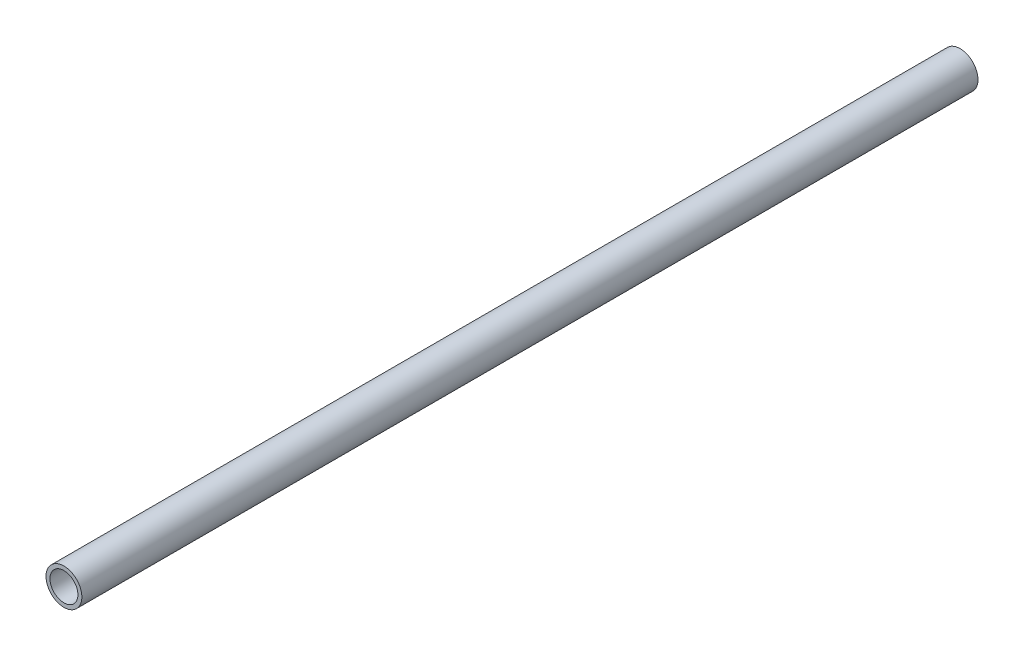
ISO-10303-21;
HEADER;
FILE_DESCRIPTION(('STEP AP214'),'2;1');
FILE_NAME('part.step','',(''),(''),'','','');
FILE_SCHEMA(('AUTOMOTIVE_DESIGN { 1 0 10303 214 1 1 1 1 }'));
ENDSEC;
DATA;
#1=APPLICATION_CONTEXT('core data for automotive mechanical design processes');
#2=APPLICATION_PROTOCOL_DEFINITION('international standard','automotive_design',2000,#1);
#3=PRODUCT_CONTEXT('',#1,'mechanical');
#4=PRODUCT('Part','Part','',(#3));
#5=PRODUCT_RELATED_PRODUCT_CATEGORY('part','',(#4));
#6=PRODUCT_DEFINITION_FORMATION('','',#4);
#7=PRODUCT_DEFINITION_CONTEXT('part definition',#1,'design');
#8=PRODUCT_DEFINITION('design','',#6,#7);
#9=PRODUCT_DEFINITION_SHAPE('','',#8);
#10=(LENGTH_UNIT() NAMED_UNIT(*) SI_UNIT(.MILLI.,.METRE.));
#11=(NAMED_UNIT(*) PLANE_ANGLE_UNIT() SI_UNIT($,.RADIAN.));
#12=(NAMED_UNIT(*) SI_UNIT($,.STERADIAN.) SOLID_ANGLE_UNIT());
#13=UNCERTAINTY_MEASURE_WITH_UNIT(LENGTH_MEASURE(1.E-05),#10,'distance_accuracy_value','');
#14=(GEOMETRIC_REPRESENTATION_CONTEXT(3) GLOBAL_UNCERTAINTY_ASSIGNED_CONTEXT((#13)) GLOBAL_UNIT_ASSIGNED_CONTEXT((#10,
#11,#12)) REPRESENTATION_CONTEXT('',''));
#15=CARTESIAN_POINT('',(0.,0.,0.));
#16=DIRECTION('',(0.,0.,1.));
#17=DIRECTION('',(1.,0.,0.));
#18=AXIS2_PLACEMENT_3D('',#15,#16,#17);
#19=CARTESIAN_POINT('',(0.,0.,-125.));
#20=DIRECTION('',(0.,0.,1.));
#21=DIRECTION('',(1.,0.,0.));
#22=AXIS2_PLACEMENT_3D('',#19,#20,#21);
#23=PLANE('',#22);
#24=CARTESIAN_POINT('',(0.,0.,-125.));
#25=DIRECTION('',(0.,0.,-1.));
#26=DIRECTION('',(1.,0.,0.));
#27=AXIS2_PLACEMENT_3D('',#24,#25,#26);
#28=CIRCLE('',#27,5.);
#29=CARTESIAN_POINT('',(5.,0.,-125.));
#30=VERTEX_POINT('',#29);
#31=CARTESIAN_POINT('',(-5.,0.,-125.));
#32=VERTEX_POINT('',#31);
#33=EDGE_CURVE('E11',#30,#32,#28,.T.);
#34=ORIENTED_EDGE('',*,*,#33,.T.);
#35=CARTESIAN_POINT('',(0.,0.,-125.));
#36=DIRECTION('',(0.,0.,-1.));
#37=DIRECTION('',(1.,0.,0.));
#38=AXIS2_PLACEMENT_3D('',#35,#36,#37);
#39=CIRCLE('',#38,5.);
#40=EDGE_CURVE('E26',#32,#30,#39,.T.);
#41=ORIENTED_EDGE('',*,*,#40,.T.);
#42=EDGE_LOOP('',(#34,#41));
#43=FACE_BOUND('',#42,.T.);
#44=CARTESIAN_POINT('',(0.,0.,-125.));
#45=DIRECTION('',(0.,0.,1.));
#46=DIRECTION('',(-1.,0.,0.));
#47=AXIS2_PLACEMENT_3D('',#44,#45,#46);
#48=CIRCLE('',#47,3.9);
#49=CARTESIAN_POINT('',(3.9,0.,-125.));
#50=VERTEX_POINT('',#49);
#51=EDGE_CURVE('E75',#50,#50,#48,.T.);
#52=ORIENTED_EDGE('',*,*,#51,.T.);
#53=EDGE_LOOP('',(#52));
#54=FACE_BOUND('',#53,.T.);
#55=ADVANCED_FACE('F16',(#43,#54),#23,.F.);
#56=CARTESIAN_POINT('',(0.,0.,0.));
#57=DIRECTION('',(0.,0.,1.));
#58=DIRECTION('',(-1.,0.,0.));
#59=AXIS2_PLACEMENT_3D('',#56,#57,#58);
#60=CYLINDRICAL_SURFACE('',#59,3.9);
#61=CARTESIAN_POINT('',(0.,0.,125.));
#62=DIRECTION('',(0.,0.,-1.));
#63=DIRECTION('',(-1.,0.,0.));
#64=AXIS2_PLACEMENT_3D('',#61,#62,#63);
#65=CIRCLE('',#64,3.9);
#66=CARTESIAN_POINT('',(3.9,0.,125.));
#67=VERTEX_POINT('',#66);
#68=EDGE_CURVE('E19',#67,#67,#65,.T.);
#69=ORIENTED_EDGE('',*,*,#68,.F.);
#70=DIRECTION('',(0.,0.,-1.));
#71=VECTOR('',#70,1.);
#72=CARTESIAN_POINT('',(3.9,0.,0.));
#73=LINE('',#72,#71);
#74=EDGE_CURVE('E68',#67,#50,#73,.T.);
#75=ORIENTED_EDGE('',*,*,#74,.T.);
#76=ORIENTED_EDGE('',*,*,#51,.F.);
#77=ORIENTED_EDGE('',*,*,#74,.F.);
#78=EDGE_LOOP('',(#69,#75,#76,#77));
#79=FACE_BOUND('',#78,.T.);
#80=ADVANCED_FACE('F88',(#79),#60,.F.);
#81=CARTESIAN_POINT('',(0.,0.,0.));
#82=DIRECTION('',(0.,0.,1.));
#83=DIRECTION('',(1.,0.,0.));
#84=AXIS2_PLACEMENT_3D('',#81,#82,#83);
#85=CYLINDRICAL_SURFACE('',#84,5.);
#86=CARTESIAN_POINT('',(0.,0.,125.));
#87=DIRECTION('',(0.,0.,1.));
#88=DIRECTION('',(1.,0.,0.));
#89=AXIS2_PLACEMENT_3D('',#86,#87,#88);
#90=CIRCLE('',#89,5.);
#91=CARTESIAN_POINT('',(5.,0.,125.));
#92=VERTEX_POINT('',#91);
#93=CARTESIAN_POINT('',(-5.,0.,125.));
#94=VERTEX_POINT('',#93);
#95=EDGE_CURVE('E51',#92,#94,#90,.T.);
#96=ORIENTED_EDGE('',*,*,#95,.F.);
#97=CARTESIAN_POINT('',(0.,0.,125.));
#98=DIRECTION('',(0.,0.,1.));
#99=DIRECTION('',(1.,0.,0.));
#100=AXIS2_PLACEMENT_3D('',#97,#98,#99);
#101=CIRCLE('',#100,5.);
#102=EDGE_CURVE('E57',#94,#92,#101,.T.);
#103=ORIENTED_EDGE('',*,*,#102,.F.);
#104=DIRECTION('',(0.,0.,-1.));
#105=VECTOR('',#104,1.);
#106=CARTESIAN_POINT('',(-5.,0.,0.));
#107=LINE('',#106,#105);
#108=EDGE_CURVE('E59',#94,#32,#107,.T.);
#109=ORIENTED_EDGE('',*,*,#108,.T.);
#110=ORIENTED_EDGE('',*,*,#33,.F.);
#111=ORIENTED_EDGE('',*,*,#40,.F.);
#112=ORIENTED_EDGE('',*,*,#108,.F.);
#113=EDGE_LOOP('',(#96,#103,#109,#110,#111,#112));
#114=FACE_BOUND('',#113,.T.);
#115=ADVANCED_FACE('F58',(#114),#85,.T.);
#116=CARTESIAN_POINT('',(0.,0.,125.));
#117=DIRECTION('',(0.,0.,1.));
#118=DIRECTION('',(1.,0.,0.));
#119=AXIS2_PLACEMENT_3D('',#116,#117,#118);
#120=PLANE('',#119);
#121=ORIENTED_EDGE('',*,*,#95,.T.);
#122=ORIENTED_EDGE('',*,*,#102,.T.);
#123=EDGE_LOOP('',(#121,#122));
#124=FACE_BOUND('',#123,.T.);
#125=ORIENTED_EDGE('',*,*,#68,.T.);
#126=EDGE_LOOP('',(#125));
#127=FACE_BOUND('',#126,.T.);
#128=ADVANCED_FACE('F63',(#124,#127),#120,.T.);
#129=CLOSED_SHELL('',(#55,#80,#115,#128));
#130=MANIFOLD_SOLID_BREP('B1',#129);
#131=ADVANCED_BREP_SHAPE_REPRESENTATION('',(#18,#130),#14);
#132=SHAPE_DEFINITION_REPRESENTATION(#9,#131);
ENDSEC;
END-ISO-10303-21;
